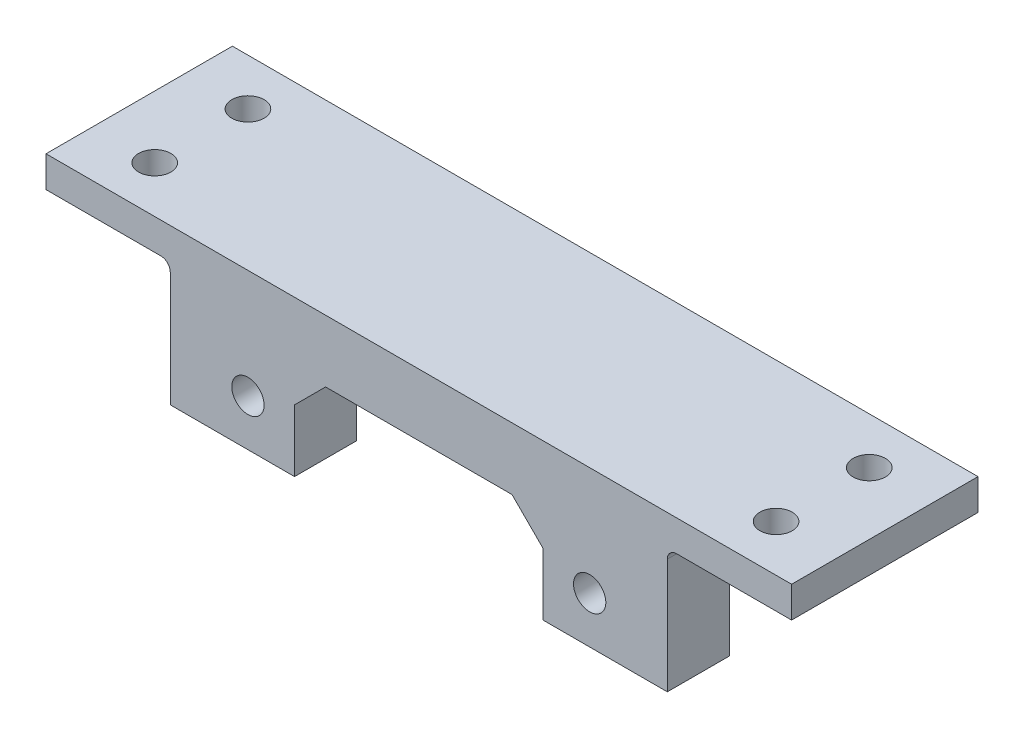
ISO-10303-21;
HEADER;
FILE_DESCRIPTION(('STEP AP214'),'2;1');
FILE_NAME('part.step','',(''),(''),'','','');
FILE_SCHEMA(('AUTOMOTIVE_DESIGN { 1 0 10303 214 1 1 1 1 }'));
ENDSEC;
DATA;
#1=APPLICATION_CONTEXT('core data for automotive mechanical design processes');
#2=APPLICATION_PROTOCOL_DEFINITION('international standard','automotive_design',2000,#1);
#3=PRODUCT_CONTEXT('',#1,'mechanical');
#4=PRODUCT('Part','Part','',(#3));
#5=PRODUCT_RELATED_PRODUCT_CATEGORY('part','',(#4));
#6=PRODUCT_DEFINITION_FORMATION('','',#4);
#7=PRODUCT_DEFINITION_CONTEXT('part definition',#1,'design');
#8=PRODUCT_DEFINITION('design','',#6,#7);
#9=PRODUCT_DEFINITION_SHAPE('','',#8);
#10=(LENGTH_UNIT() NAMED_UNIT(*) SI_UNIT(.MILLI.,.METRE.));
#11=(NAMED_UNIT(*) PLANE_ANGLE_UNIT() SI_UNIT($,.RADIAN.));
#12=(NAMED_UNIT(*) SI_UNIT($,.STERADIAN.) SOLID_ANGLE_UNIT());
#13=UNCERTAINTY_MEASURE_WITH_UNIT(LENGTH_MEASURE(1.E-05),#10,'distance_accuracy_value','');
#14=(GEOMETRIC_REPRESENTATION_CONTEXT(3) GLOBAL_UNCERTAINTY_ASSIGNED_CONTEXT((#13)) GLOBAL_UNIT_ASSIGNED_CONTEXT((#10,
#11,#12)) REPRESENTATION_CONTEXT('',''));
#15=CARTESIAN_POINT('',(0.,0.,0.));
#16=DIRECTION('',(0.,0.,1.));
#17=DIRECTION('',(1.,0.,0.));
#18=AXIS2_PLACEMENT_3D('',#15,#16,#17);
#19=CARTESIAN_POINT('',(0.,-20.,30.));
#20=DIRECTION('',(0.,1.,0.));
#21=DIRECTION('',(0.,0.,1.));
#22=AXIS2_PLACEMENT_3D('',#19,#20,#21);
#23=PLANE('',#22);
#24=DIRECTION('',(0.,0.,-1.));
#25=VECTOR('',#24,1.);
#26=CARTESIAN_POINT('',(40.,-20.,30.));
#27=LINE('',#26,#25);
#28=CARTESIAN_POINT('',(40.,-20.,10.));
#29=VERTEX_POINT('',#28);
#30=CARTESIAN_POINT('',(40.,-20.,0.));
#31=VERTEX_POINT('',#30);
#32=EDGE_CURVE('E367',#29,#31,#27,.T.);
#33=ORIENTED_EDGE('',*,*,#32,.F.);
#34=DIRECTION('',(-1.,0.,0.));
#35=VECTOR('',#34,1.);
#36=CARTESIAN_POINT('',(120.,-19.9999999999999,10.));
#37=LINE('',#36,#35);
#38=CARTESIAN_POINT('',(20.,-20.,10.));
#39=VERTEX_POINT('',#38);
#40=EDGE_CURVE('E557',#29,#39,#37,.T.);
#41=ORIENTED_EDGE('',*,*,#40,.T.);
#42=DIRECTION('',(0.,0.,-1.));
#43=VECTOR('',#42,1.);
#44=CARTESIAN_POINT('',(20.,-20.,30.));
#45=LINE('',#44,#43);
#46=CARTESIAN_POINT('',(20.,-20.,0.));
#47=VERTEX_POINT('',#46);
#48=EDGE_CURVE('E238',#39,#47,#45,.T.);
#49=ORIENTED_EDGE('',*,*,#48,.T.);
#50=DIRECTION('',(1.,0.,0.));
#51=VECTOR('',#50,1.);
#52=CARTESIAN_POINT('',(0.,-20.,0.));
#53=LINE('',#52,#51);
#54=EDGE_CURVE('E340',#47,#31,#53,.T.);
#55=ORIENTED_EDGE('',*,*,#54,.T.);
#56=EDGE_LOOP('',(#33,#41,#49,#55));
#57=FACE_BOUND('',#56,.T.);
#58=ADVANCED_FACE('F37',(#57),#23,.F.);
#59=CARTESIAN_POINT('',(40.,0.,30.));
#60=DIRECTION('',(-1.,0.,0.));
#61=DIRECTION('',(0.,0.,1.));
#62=AXIS2_PLACEMENT_3D('',#59,#60,#61);
#63=PLANE('',#62);
#64=DIRECTION('',(0.,0.,1.));
#65=VECTOR('',#64,1.);
#66=CARTESIAN_POINT('',(40.,-9.99999999999996,30.));
#67=LINE('',#66,#65);
#68=CARTESIAN_POINT('',(40.,-9.99999999999996,0.));
#69=VERTEX_POINT('',#68);
#70=CARTESIAN_POINT('',(40.,-9.99999999999996,9.99999999999999));
#71=VERTEX_POINT('',#70);
#72=EDGE_CURVE('E266',#69,#71,#67,.T.);
#73=ORIENTED_EDGE('',*,*,#72,.T.);
#74=DIRECTION('',(0.,-1.,0.));
#75=VECTOR('',#74,1.);
#76=CARTESIAN_POINT('',(40.,0.,9.99999999999999));
#77=LINE('',#76,#75);
#78=EDGE_CURVE('E566',#71,#29,#77,.T.);
#79=ORIENTED_EDGE('',*,*,#78,.T.);
#80=ORIENTED_EDGE('',*,*,#32,.T.);
#81=DIRECTION('',(0.,1.,0.));
#82=VECTOR('',#81,1.);
#83=CARTESIAN_POINT('',(40.,0.,0.));
#84=LINE('',#83,#82);
#85=EDGE_CURVE('E348',#31,#69,#84,.T.);
#86=ORIENTED_EDGE('',*,*,#85,.T.);
#87=EDGE_LOOP('',(#73,#79,#80,#86));
#88=FACE_BOUND('',#87,.T.);
#89=ADVANCED_FACE('F482',(#88),#63,.F.);
#90=CARTESIAN_POINT('',(80.,0.,30.));
#91=DIRECTION('',(1.,0.,0.));
#92=DIRECTION('',(0.,0.,-1.));
#93=AXIS2_PLACEMENT_3D('',#90,#91,#92);
#94=PLANE('',#93);
#95=DIRECTION('',(0.,0.,-1.));
#96=VECTOR('',#95,1.);
#97=CARTESIAN_POINT('',(80.,-20.,30.));
#98=LINE('',#97,#96);
#99=CARTESIAN_POINT('',(80.,-19.9999999999999,10.));
#100=VERTEX_POINT('',#99);
#101=CARTESIAN_POINT('',(80.,-20.,0.));
#102=VERTEX_POINT('',#101);
#103=EDGE_CURVE('E363',#100,#102,#98,.T.);
#104=ORIENTED_EDGE('',*,*,#103,.F.);
#105=DIRECTION('',(0.,1.,0.));
#106=VECTOR('',#105,1.);
#107=CARTESIAN_POINT('',(80.,0.,9.99999999999999));
#108=LINE('',#107,#106);
#109=CARTESIAN_POINT('',(80.,-10.,9.99999999999999));
#110=VERTEX_POINT('',#109);
#111=EDGE_CURVE('E444',#100,#110,#108,.T.);
#112=ORIENTED_EDGE('',*,*,#111,.T.);
#113=DIRECTION('',(0.,0.,-1.));
#114=VECTOR('',#113,1.);
#115=CARTESIAN_POINT('',(80.,-10.,0.));
#116=LINE('',#115,#114);
#117=CARTESIAN_POINT('',(80.,-10.,0.));
#118=VERTEX_POINT('',#117);
#119=EDGE_CURVE('E253',#110,#118,#116,.T.);
#120=ORIENTED_EDGE('',*,*,#119,.T.);
#121=DIRECTION('',(0.,-1.,0.));
#122=VECTOR('',#121,1.);
#123=CARTESIAN_POINT('',(80.,0.,0.));
#124=LINE('',#123,#122);
#125=EDGE_CURVE('E354',#118,#102,#124,.T.);
#126=ORIENTED_EDGE('',*,*,#125,.T.);
#127=EDGE_LOOP('',(#104,#112,#120,#126));
#128=FACE_BOUND('',#127,.T.);
#129=ADVANCED_FACE('F382',(#128),#94,.F.);
#130=CARTESIAN_POINT('',(0.,-20.,30.));
#131=DIRECTION('',(0.,1.,0.));
#132=DIRECTION('',(0.,0.,1.));
#133=AXIS2_PLACEMENT_3D('',#130,#131,#132);
#134=PLANE('',#133);
#135=DIRECTION('',(0.,0.,-1.));
#136=VECTOR('',#135,1.);
#137=CARTESIAN_POINT('',(100.,-20.,30.));
#138=LINE('',#137,#136);
#139=CARTESIAN_POINT('',(100.,-19.9999999999999,10.));
#140=VERTEX_POINT('',#139);
#141=CARTESIAN_POINT('',(100.,-20.,0.));
#142=VERTEX_POINT('',#141);
#143=EDGE_CURVE('E364',#140,#142,#138,.T.);
#144=ORIENTED_EDGE('',*,*,#143,.F.);
#145=EDGE_CURVE('E378',#140,#100,#37,.T.);
#146=ORIENTED_EDGE('',*,*,#145,.T.);
#147=ORIENTED_EDGE('',*,*,#103,.T.);
#148=DIRECTION('',(1.,0.,0.));
#149=VECTOR('',#148,1.);
#150=CARTESIAN_POINT('',(0.,-20.,0.));
#151=LINE('',#150,#149);
#152=EDGE_CURVE('E357',#102,#142,#151,.T.);
#153=ORIENTED_EDGE('',*,*,#152,.T.);
#154=EDGE_LOOP('',(#144,#146,#147,#153));
#155=FACE_BOUND('',#154,.T.);
#156=ADVANCED_FACE('F376',(#155),#134,.F.);
#157=CARTESIAN_POINT('',(80.,-10.,30.));
#158=DIRECTION('',(-0.707106781186552,-0.707106781186544,0.));
#159=DIRECTION('',(0.,0.,1.));
#160=AXIS2_PLACEMENT_3D('',#157,#158,#159);
#161=PLANE('',#160);
#162=ORIENTED_EDGE('',*,*,#119,.F.);
#163=DIRECTION('',(0.707106781186544,-0.707106781186552,0.));
#164=VECTOR('',#163,1.);
#165=CARTESIAN_POINT('',(80.,-10.,9.99999999999999));
#166=LINE('',#165,#164);
#167=CARTESIAN_POINT('',(75.,-4.99999999999995,10.));
#168=VERTEX_POINT('',#167);
#169=EDGE_CURVE('E449',#110,#168,#166,.F.);
#170=ORIENTED_EDGE('',*,*,#169,.T.);
#171=DIRECTION('',(0.,0.,1.));
#172=VECTOR('',#171,1.);
#173=CARTESIAN_POINT('',(75.,-5.,30.));
#174=LINE('',#173,#172);
#175=CARTESIAN_POINT('',(75.,-5.,0.));
#176=VERTEX_POINT('',#175);
#177=EDGE_CURVE('E262',#176,#168,#174,.T.);
#178=ORIENTED_EDGE('',*,*,#177,.F.);
#179=DIRECTION('',(0.707106781186544,-0.707106781186552,0.));
#180=VECTOR('',#179,1.);
#181=CARTESIAN_POINT('',(35.0000000000004,35.,0.));
#182=LINE('',#181,#180);
#183=EDGE_CURVE('E269',#118,#176,#182,.F.);
#184=ORIENTED_EDGE('',*,*,#183,.F.);
#185=EDGE_LOOP('',(#162,#170,#178,#184));
#186=FACE_BOUND('',#185,.T.);
#187=ADVANCED_FACE('F571',(#186),#161,.T.);
#188=CARTESIAN_POINT('',(45.0000000000001,-5.,30.));
#189=DIRECTION('',(0.707106781186543,-0.707106781186552,0.));
#190=DIRECTION('',(0.,0.,1.));
#191=AXIS2_PLACEMENT_3D('',#188,#189,#190);
#192=PLANE('',#191);
#193=DIRECTION('',(0.,0.,-1.));
#194=VECTOR('',#193,1.);
#195=CARTESIAN_POINT('',(45.0000000000001,-5.,0.));
#196=LINE('',#195,#194);
#197=CARTESIAN_POINT('',(45.0000000000001,-4.99999999999998,10.));
#198=VERTEX_POINT('',#197);
#199=CARTESIAN_POINT('',(45.0000000000001,-5.,0.));
#200=VERTEX_POINT('',#199);
#201=EDGE_CURVE('E257',#198,#200,#196,.T.);
#202=ORIENTED_EDGE('',*,*,#201,.F.);
#203=DIRECTION('',(0.707106781186552,0.707106781186543,0.));
#204=VECTOR('',#203,1.);
#205=CARTESIAN_POINT('',(45.0000000000001,-5.,9.99999999999999));
#206=LINE('',#205,#204);
#207=EDGE_CURVE('E290',#198,#71,#206,.F.);
#208=ORIENTED_EDGE('',*,*,#207,.T.);
#209=ORIENTED_EDGE('',*,*,#72,.F.);
#210=DIRECTION('',(0.707106781186552,0.707106781186543,0.));
#211=VECTOR('',#210,1.);
#212=CARTESIAN_POINT('',(24.9999999999997,-25.0000000000001,0.));
#213=LINE('',#212,#211);
#214=EDGE_CURVE('E273',#200,#69,#213,.F.);
#215=ORIENTED_EDGE('',*,*,#214,.F.);
#216=EDGE_LOOP('',(#202,#208,#209,#215));
#217=FACE_BOUND('',#216,.T.);
#218=ADVANCED_FACE('F526',(#217),#192,.T.);
#219=CARTESIAN_POINT('',(100.,0.,30.));
#220=DIRECTION('',(-1.,0.,0.));
#221=DIRECTION('',(0.,0.,1.));
#222=AXIS2_PLACEMENT_3D('',#219,#220,#221);
#223=PLANE('',#222);
#224=DIRECTION('',(0.,1.,0.));
#225=VECTOR('',#224,1.);
#226=CARTESIAN_POINT('',(100.,0.,0.));
#227=LINE('',#226,#225);
#228=CARTESIAN_POINT('',(100.,-1.5,0.));
#229=VERTEX_POINT('',#228);
#230=EDGE_CURVE('E281',#142,#229,#227,.T.);
#231=ORIENTED_EDGE('',*,*,#230,.T.);
#232=DIRECTION('',(0.,0.,-1.));
#233=VECTOR('',#232,1.);
#234=CARTESIAN_POINT('',(100.,-1.5,30.));
#235=LINE('',#234,#233);
#236=CARTESIAN_POINT('',(100.,-1.5,30.));
#237=VERTEX_POINT('',#236);
#238=EDGE_CURVE('E52',#229,#237,#235,.F.);
#239=ORIENTED_EDGE('',*,*,#238,.T.);
#240=DIRECTION('',(0.,1.,0.));
#241=VECTOR('',#240,1.);
#242=CARTESIAN_POINT('',(100.,0.,30.));
#243=LINE('',#242,#241);
#244=CARTESIAN_POINT('',(100.,-20.,30.));
#245=VERTEX_POINT('',#244);
#246=EDGE_CURVE('E360',#245,#237,#243,.T.);
#247=ORIENTED_EDGE('',*,*,#246,.F.);
#248=CARTESIAN_POINT('',(100.,-19.9999999999999,20.));
#249=VERTEX_POINT('',#248);
#250=EDGE_CURVE('E361',#245,#249,#138,.T.);
#251=ORIENTED_EDGE('',*,*,#250,.T.);
#252=DIRECTION('',(0.,1.,0.));
#253=VECTOR('',#252,1.);
#254=CARTESIAN_POINT('',(100.,0.,20.));
#255=LINE('',#254,#253);
#256=CARTESIAN_POINT('',(100.,-4.99999999999993,20.));
#257=VERTEX_POINT('',#256);
#258=EDGE_CURVE('E563',#249,#257,#255,.T.);
#259=ORIENTED_EDGE('',*,*,#258,.T.);
#260=DIRECTION('',(0.,0.,-1.));
#261=VECTOR('',#260,1.);
#262=CARTESIAN_POINT('',(100.,-4.99999999999993,30.));
#263=LINE('',#262,#261);
#264=CARTESIAN_POINT('',(100.,-4.99999999999993,10.));
#265=VERTEX_POINT('',#264);
#266=EDGE_CURVE('E440',#257,#265,#263,.T.);
#267=ORIENTED_EDGE('',*,*,#266,.T.);
#268=DIRECTION('',(0.,-1.,0.));
#269=VECTOR('',#268,1.);
#270=CARTESIAN_POINT('',(100.,0.,9.99999999999999));
#271=LINE('',#270,#269);
#272=EDGE_CURVE('E438',#265,#140,#271,.T.);
#273=ORIENTED_EDGE('',*,*,#272,.T.);
#274=ORIENTED_EDGE('',*,*,#143,.T.);
#275=EDGE_LOOP('',(#231,#239,#247,#251,#259,#267,#273,#274));
#276=FACE_BOUND('',#275,.T.);
#277=ADVANCED_FACE('F436',(#276),#223,.F.);
#278=CARTESIAN_POINT('',(0.,0.,30.));
#279=DIRECTION('',(0.,1.,0.));
#280=DIRECTION('',(0.,0.,1.));
#281=AXIS2_PLACEMENT_3D('',#278,#279,#280);
#282=PLANE('',#281);
#283=CARTESIAN_POINT('',(110.,0.,7.5));
#284=DIRECTION('',(0.,1.,0.));
#285=DIRECTION('',(0.,0.,1.));
#286=AXIS2_PLACEMENT_3D('',#283,#284,#285);
#287=CIRCLE('',#286,2.6);
#288=CARTESIAN_POINT('',(110.,0.,10.1));
#289=VERTEX_POINT('',#288);
#290=EDGE_CURVE('E458',#289,#289,#287,.T.);
#291=ORIENTED_EDGE('',*,*,#290,.T.);
#292=EDGE_LOOP('',(#291));
#293=FACE_BOUND('',#292,.T.);
#294=CARTESIAN_POINT('',(110.,0.,22.5));
#295=DIRECTION('',(0.,1.,0.));
#296=DIRECTION('',(0.,0.,1.));
#297=AXIS2_PLACEMENT_3D('',#294,#295,#296);
#298=CIRCLE('',#297,2.6);
#299=CARTESIAN_POINT('',(110.,0.,25.1));
#300=VERTEX_POINT('',#299);
#301=EDGE_CURVE('E286',#300,#300,#298,.T.);
#302=ORIENTED_EDGE('',*,*,#301,.T.);
#303=EDGE_LOOP('',(#302));
#304=FACE_BOUND('',#303,.T.);
#305=DIRECTION('',(1.,0.,0.));
#306=VECTOR('',#305,1.);
#307=CARTESIAN_POINT('',(0.,0.,30.));
#308=LINE('',#307,#306);
#309=CARTESIAN_POINT('',(101.5,0.,30.));
#310=VERTEX_POINT('',#309);
#311=CARTESIAN_POINT('',(120.,0.,30.));
#312=VERTEX_POINT('',#311);
#313=EDGE_CURVE('E411',#310,#312,#308,.T.);
#314=ORIENTED_EDGE('',*,*,#313,.F.);
#315=DIRECTION('',(0.,0.,-1.));
#316=VECTOR('',#315,1.);
#317=CARTESIAN_POINT('',(101.5,0.,0.));
#318=LINE('',#317,#316);
#319=CARTESIAN_POINT('',(101.5,0.,0.));
#320=VERTEX_POINT('',#319);
#321=EDGE_CURVE('E307',#310,#320,#318,.T.);
#322=ORIENTED_EDGE('',*,*,#321,.T.);
#323=DIRECTION('',(1.,0.,0.));
#324=VECTOR('',#323,1.);
#325=CARTESIAN_POINT('',(0.,0.,0.));
#326=LINE('',#325,#324);
#327=CARTESIAN_POINT('',(120.,0.,0.));
#328=VERTEX_POINT('',#327);
#329=EDGE_CURVE('E385',#320,#328,#326,.T.);
#330=ORIENTED_EDGE('',*,*,#329,.T.);
#331=DIRECTION('',(0.,0.,-1.));
#332=VECTOR('',#331,1.);
#333=CARTESIAN_POINT('',(120.,0.,30.));
#334=LINE('',#333,#332);
#335=EDGE_CURVE('E250',#312,#328,#334,.T.);
#336=ORIENTED_EDGE('',*,*,#335,.F.);
#337=EDGE_LOOP('',(#314,#322,#330,#336));
#338=FACE_BOUND('',#337,.T.);
#339=ADVANCED_FACE('F410',(#293,#304,#338),#282,.F.);
#340=CARTESIAN_POINT('',(120.,0.,30.));
#341=DIRECTION('',(-1.,0.,0.));
#342=DIRECTION('',(0.,0.,1.));
#343=AXIS2_PLACEMENT_3D('',#340,#341,#342);
#344=PLANE('',#343);
#345=DIRECTION('',(0.,1.,0.));
#346=VECTOR('',#345,1.);
#347=CARTESIAN_POINT('',(120.,0.,0.));
#348=LINE('',#347,#346);
#349=CARTESIAN_POINT('',(120.,5.,0.));
#350=VERTEX_POINT('',#349);
#351=EDGE_CURVE('E387',#328,#350,#348,.T.);
#352=ORIENTED_EDGE('',*,*,#351,.T.);
#353=DIRECTION('',(0.,0.,-1.));
#354=VECTOR('',#353,1.);
#355=CARTESIAN_POINT('',(120.,5.,30.));
#356=LINE('',#355,#354);
#357=CARTESIAN_POINT('',(120.,5.,30.));
#358=VERTEX_POINT('',#357);
#359=EDGE_CURVE('E248',#358,#350,#356,.T.);
#360=ORIENTED_EDGE('',*,*,#359,.F.);
#361=DIRECTION('',(0.,1.,0.));
#362=VECTOR('',#361,1.);
#363=CARTESIAN_POINT('',(120.,0.,30.));
#364=LINE('',#363,#362);
#365=EDGE_CURVE('E407',#312,#358,#364,.T.);
#366=ORIENTED_EDGE('',*,*,#365,.F.);
#367=ORIENTED_EDGE('',*,*,#335,.T.);
#368=EDGE_LOOP('',(#352,#360,#366,#367));
#369=FACE_BOUND('',#368,.T.);
#370=ADVANCED_FACE('F405',(#369),#344,.F.);
#371=CARTESIAN_POINT('',(0.,5.,30.));
#372=DIRECTION('',(0.,1.,0.));
#373=DIRECTION('',(0.,0.,1.));
#374=AXIS2_PLACEMENT_3D('',#371,#372,#373);
#375=PLANE('',#374);
#376=CARTESIAN_POINT('',(10.,5.,22.5));
#377=DIRECTION('',(0.,1.,0.));
#378=DIRECTION('',(0.,0.,1.));
#379=AXIS2_PLACEMENT_3D('',#376,#377,#378);
#380=CIRCLE('',#379,2.6);
#381=CARTESIAN_POINT('',(10.,5.,25.1));
#382=VERTEX_POINT('',#381);
#383=EDGE_CURVE('E287',#382,#382,#380,.T.);
#384=ORIENTED_EDGE('',*,*,#383,.F.);
#385=EDGE_LOOP('',(#384));
#386=FACE_BOUND('',#385,.T.);
#387=CARTESIAN_POINT('',(110.,5.,7.5));
#388=DIRECTION('',(0.,1.,0.));
#389=DIRECTION('',(0.,0.,1.));
#390=AXIS2_PLACEMENT_3D('',#387,#388,#389);
#391=CIRCLE('',#390,2.6);
#392=CARTESIAN_POINT('',(110.,5.,10.1));
#393=VERTEX_POINT('',#392);
#394=EDGE_CURVE('E447',#393,#393,#391,.T.);
#395=ORIENTED_EDGE('',*,*,#394,.F.);
#396=EDGE_LOOP('',(#395));
#397=FACE_BOUND('',#396,.T.);
#398=CARTESIAN_POINT('',(110.,5.,22.5));
#399=DIRECTION('',(0.,1.,0.));
#400=DIRECTION('',(0.,0.,1.));
#401=AXIS2_PLACEMENT_3D('',#398,#399,#400);
#402=CIRCLE('',#401,2.6);
#403=CARTESIAN_POINT('',(110.,5.,25.1));
#404=VERTEX_POINT('',#403);
#405=EDGE_CURVE('E443',#404,#404,#402,.T.);
#406=ORIENTED_EDGE('',*,*,#405,.F.);
#407=EDGE_LOOP('',(#406));
#408=FACE_BOUND('',#407,.T.);
#409=CARTESIAN_POINT('',(10.,5.,7.5));
#410=DIRECTION('',(0.,1.,0.));
#411=DIRECTION('',(0.,0.,1.));
#412=AXIS2_PLACEMENT_3D('',#409,#410,#411);
#413=CIRCLE('',#412,2.6);
#414=CARTESIAN_POINT('',(10.,5.,10.1));
#415=VERTEX_POINT('',#414);
#416=EDGE_CURVE('E282',#415,#415,#413,.T.);
#417=ORIENTED_EDGE('',*,*,#416,.F.);
#418=EDGE_LOOP('',(#417));
#419=FACE_BOUND('',#418,.T.);
#420=DIRECTION('',(1.,0.,0.));
#421=VECTOR('',#420,1.);
#422=CARTESIAN_POINT('',(0.,5.,0.));
#423=LINE('',#422,#421);
#424=CARTESIAN_POINT('',(0.,5.,0.));
#425=VERTEX_POINT('',#424);
#426=EDGE_CURVE('E342',#425,#350,#423,.T.);
#427=ORIENTED_EDGE('',*,*,#426,.F.);
#428=DIRECTION('',(0.,0.,-1.));
#429=VECTOR('',#428,1.);
#430=CARTESIAN_POINT('',(0.,5.,30.));
#431=LINE('',#430,#429);
#432=CARTESIAN_POINT('',(0.,5.,30.));
#433=VERTEX_POINT('',#432);
#434=EDGE_CURVE('E240',#433,#425,#431,.T.);
#435=ORIENTED_EDGE('',*,*,#434,.F.);
#436=DIRECTION('',(1.,0.,0.));
#437=VECTOR('',#436,1.);
#438=CARTESIAN_POINT('',(0.,5.,30.));
#439=LINE('',#438,#437);
#440=EDGE_CURVE('E402',#433,#358,#439,.T.);
#441=ORIENTED_EDGE('',*,*,#440,.T.);
#442=ORIENTED_EDGE('',*,*,#359,.T.);
#443=EDGE_LOOP('',(#427,#435,#441,#442));
#444=FACE_BOUND('',#443,.T.);
#445=ADVANCED_FACE('F398',(#386,#397,#408,#419,#444),#375,.T.);
#446=CARTESIAN_POINT('',(0.,0.,30.));
#447=DIRECTION('',(-1.,0.,0.));
#448=DIRECTION('',(0.,0.,1.));
#449=AXIS2_PLACEMENT_3D('',#446,#447,#448);
#450=PLANE('',#449);
#451=DIRECTION('',(0.,1.,0.));
#452=VECTOR('',#451,1.);
#453=CARTESIAN_POINT('',(0.,0.,0.));
#454=LINE('',#453,#452);
#455=CARTESIAN_POINT('',(0.,0.,0.));
#456=VERTEX_POINT('',#455);
#457=EDGE_CURVE('E338',#456,#425,#454,.T.);
#458=ORIENTED_EDGE('',*,*,#457,.F.);
#459=DIRECTION('',(0.,0.,-1.));
#460=VECTOR('',#459,1.);
#461=CARTESIAN_POINT('',(0.,0.,30.));
#462=LINE('',#461,#460);
#463=CARTESIAN_POINT('',(0.,0.,30.));
#464=VERTEX_POINT('',#463);
#465=EDGE_CURVE('E237',#464,#456,#462,.T.);
#466=ORIENTED_EDGE('',*,*,#465,.F.);
#467=DIRECTION('',(0.,1.,0.));
#468=VECTOR('',#467,1.);
#469=CARTESIAN_POINT('',(0.,0.,30.));
#470=LINE('',#469,#468);
#471=EDGE_CURVE('E423',#464,#433,#470,.T.);
#472=ORIENTED_EDGE('',*,*,#471,.T.);
#473=ORIENTED_EDGE('',*,*,#434,.T.);
#474=EDGE_LOOP('',(#458,#466,#472,#473));
#475=FACE_BOUND('',#474,.T.);
#476=ADVANCED_FACE('F469',(#475),#450,.T.);
#477=CARTESIAN_POINT('',(0.,0.,30.));
#478=DIRECTION('',(0.,1.,0.));
#479=DIRECTION('',(0.,0.,1.));
#480=AXIS2_PLACEMENT_3D('',#477,#478,#479);
#481=PLANE('',#480);
#482=CARTESIAN_POINT('',(10.,0.,22.5));
#483=DIRECTION('',(0.,1.,0.));
#484=DIRECTION('',(0.,0.,1.));
#485=AXIS2_PLACEMENT_3D('',#482,#483,#484);
#486=CIRCLE('',#485,2.6);
#487=CARTESIAN_POINT('',(10.,0.,25.1));
#488=VERTEX_POINT('',#487);
#489=EDGE_CURVE('E283',#488,#488,#486,.T.);
#490=ORIENTED_EDGE('',*,*,#489,.T.);
#491=EDGE_LOOP('',(#490));
#492=FACE_BOUND('',#491,.T.);
#493=CARTESIAN_POINT('',(10.,0.,7.5));
#494=DIRECTION('',(0.,1.,0.));
#495=DIRECTION('',(0.,0.,1.));
#496=AXIS2_PLACEMENT_3D('',#493,#494,#495);
#497=CIRCLE('',#496,2.6);
#498=CARTESIAN_POINT('',(10.,0.,10.1));
#499=VERTEX_POINT('',#498);
#500=EDGE_CURVE('E278',#499,#499,#497,.T.);
#501=ORIENTED_EDGE('',*,*,#500,.T.);
#502=EDGE_LOOP('',(#501));
#503=FACE_BOUND('',#502,.T.);
#504=DIRECTION('',(1.,0.,0.));
#505=VECTOR('',#504,1.);
#506=CARTESIAN_POINT('',(0.,0.,0.));
#507=LINE('',#506,#505);
#508=CARTESIAN_POINT('',(18.5,0.,0.));
#509=VERTEX_POINT('',#508);
#510=EDGE_CURVE('E332',#456,#509,#507,.T.);
#511=ORIENTED_EDGE('',*,*,#510,.T.);
#512=DIRECTION('',(0.,0.,-1.));
#513=VECTOR('',#512,1.);
#514=CARTESIAN_POINT('',(18.5,0.,30.));
#515=LINE('',#514,#513);
#516=CARTESIAN_POINT('',(18.5,0.,30.));
#517=VERTEX_POINT('',#516);
#518=EDGE_CURVE('E305',#509,#517,#515,.F.);
#519=ORIENTED_EDGE('',*,*,#518,.T.);
#520=DIRECTION('',(1.,0.,0.));
#521=VECTOR('',#520,1.);
#522=CARTESIAN_POINT('',(0.,0.,30.));
#523=LINE('',#522,#521);
#524=EDGE_CURVE('E321',#464,#517,#523,.T.);
#525=ORIENTED_EDGE('',*,*,#524,.F.);
#526=ORIENTED_EDGE('',*,*,#465,.T.);
#527=EDGE_LOOP('',(#511,#519,#525,#526));
#528=FACE_BOUND('',#527,.T.);
#529=ADVANCED_FACE('F337',(#492,#503,#528),#481,.F.);
#530=CARTESIAN_POINT('',(20.,0.,30.));
#531=DIRECTION('',(1.,0.,0.));
#532=DIRECTION('',(0.,1.,0.));
#533=AXIS2_PLACEMENT_3D('',#530,#531,#532);
#534=PLANE('',#533);
#535=DIRECTION('',(0.,-1.,0.));
#536=VECTOR('',#535,1.);
#537=CARTESIAN_POINT('',(20.,0.,30.));
#538=LINE('',#537,#536);
#539=CARTESIAN_POINT('',(20.,-1.5,30.));
#540=VERTEX_POINT('',#539);
#541=CARTESIAN_POINT('',(20.,-20.,30.));
#542=VERTEX_POINT('',#541);
#543=EDGE_CURVE('E318',#540,#542,#538,.T.);
#544=ORIENTED_EDGE('',*,*,#543,.F.);
#545=DIRECTION('',(0.,0.,-1.));
#546=VECTOR('',#545,1.);
#547=CARTESIAN_POINT('',(20.,-1.5,0.));
#548=LINE('',#547,#546);
#549=CARTESIAN_POINT('',(20.,-1.5,0.));
#550=VERTEX_POINT('',#549);
#551=EDGE_CURVE('E293',#540,#550,#548,.T.);
#552=ORIENTED_EDGE('',*,*,#551,.T.);
#553=DIRECTION('',(0.,-1.,0.));
#554=VECTOR('',#553,1.);
#555=CARTESIAN_POINT('',(20.,0.,0.));
#556=LINE('',#555,#554);
#557=EDGE_CURVE('E335',#550,#47,#556,.T.);
#558=ORIENTED_EDGE('',*,*,#557,.T.);
#559=ORIENTED_EDGE('',*,*,#48,.F.);
#560=DIRECTION('',(0.,-1.,0.));
#561=VECTOR('',#560,1.);
#562=CARTESIAN_POINT('',(20.,-20.,10.));
#563=LINE('',#562,#561);
#564=CARTESIAN_POINT('',(20.,-5.,10.));
#565=VERTEX_POINT('',#564);
#566=EDGE_CURVE('E222',#565,#39,#563,.T.);
#567=ORIENTED_EDGE('',*,*,#566,.F.);
#568=DIRECTION('',(0.,0.,-1.));
#569=VECTOR('',#568,1.);
#570=CARTESIAN_POINT('',(20.,-5.,10.));
#571=LINE('',#570,#569);
#572=CARTESIAN_POINT('',(20.,-5.,20.));
#573=VERTEX_POINT('',#572);
#574=EDGE_CURVE('E232',#573,#565,#571,.T.);
#575=ORIENTED_EDGE('',*,*,#574,.F.);
#576=DIRECTION('',(0.,1.,0.));
#577=VECTOR('',#576,1.);
#578=CARTESIAN_POINT('',(20.,-5.,20.));
#579=LINE('',#578,#577);
#580=CARTESIAN_POINT('',(20.,-20.,20.));
#581=VERTEX_POINT('',#580);
#582=EDGE_CURVE('E213',#581,#573,#579,.T.);
#583=ORIENTED_EDGE('',*,*,#582,.F.);
#584=EDGE_CURVE('E228',#542,#581,#45,.T.);
#585=ORIENTED_EDGE('',*,*,#584,.F.);
#586=EDGE_LOOP('',(#544,#552,#558,#559,#567,#575,#583,#585));
#587=FACE_BOUND('',#586,.T.);
#588=ADVANCED_FACE('F227',(#587),#534,.F.);
#589=ORIENTED_EDGE('',*,*,#584,.T.);
#590=DIRECTION('',(-1.,0.,0.));
#591=VECTOR('',#590,1.);
#592=CARTESIAN_POINT('',(120.,-19.9999999999999,20.));
#593=LINE('',#592,#591);
#594=CARTESIAN_POINT('',(40.,-20.,20.));
#595=VERTEX_POINT('',#594);
#596=EDGE_CURVE('E210',#595,#581,#593,.T.);
#597=ORIENTED_EDGE('',*,*,#596,.F.);
#598=CARTESIAN_POINT('',(40.,-20.,30.));
#599=VERTEX_POINT('',#598);
#600=EDGE_CURVE('E243',#599,#595,#27,.T.);
#601=ORIENTED_EDGE('',*,*,#600,.F.);
#602=DIRECTION('',(1.,0.,0.));
#603=VECTOR('',#602,1.);
#604=CARTESIAN_POINT('',(0.,-20.,30.));
#605=LINE('',#604,#603);
#606=EDGE_CURVE('E236',#542,#599,#605,.T.);
#607=ORIENTED_EDGE('',*,*,#606,.F.);
#608=EDGE_LOOP('',(#589,#597,#601,#607));
#609=FACE_BOUND('',#608,.T.);
#610=ADVANCED_FACE('F235',(#609),#23,.F.);
#611=ORIENTED_EDGE('',*,*,#600,.T.);
#612=DIRECTION('',(0.,1.,0.));
#613=VECTOR('',#612,1.);
#614=CARTESIAN_POINT('',(40.,0.,20.));
#615=LINE('',#614,#613);
#616=CARTESIAN_POINT('',(40.,-9.99999999999996,20.));
#617=VERTEX_POINT('',#616);
#618=EDGE_CURVE('E216',#595,#617,#615,.T.);
#619=ORIENTED_EDGE('',*,*,#618,.T.);
#620=CARTESIAN_POINT('',(40.,-9.99999999999996,30.));
#621=VERTEX_POINT('',#620);
#622=EDGE_CURVE('E265',#617,#621,#67,.T.);
#623=ORIENTED_EDGE('',*,*,#622,.T.);
#624=DIRECTION('',(0.,1.,0.));
#625=VECTOR('',#624,1.);
#626=CARTESIAN_POINT('',(40.,0.,30.));
#627=LINE('',#626,#625);
#628=EDGE_CURVE('E428',#599,#621,#627,.T.);
#629=ORIENTED_EDGE('',*,*,#628,.F.);
#630=EDGE_LOOP('',(#611,#619,#623,#629));
#631=FACE_BOUND('',#630,.T.);
#632=ADVANCED_FACE('F490',(#631),#63,.F.);
#633=CARTESIAN_POINT('',(0.,-5.,30.));
#634=DIRECTION('',(0.,1.,0.));
#635=DIRECTION('',(0.,0.,1.));
#636=AXIS2_PLACEMENT_3D('',#633,#634,#635);
#637=PLANE('',#636);
#638=CARTESIAN_POINT('',(45.0000000000001,-5.,30.));
#639=VERTEX_POINT('',#638);
#640=CARTESIAN_POINT('',(45.0000000000001,-5.,20.));
#641=VERTEX_POINT('',#640);
#642=EDGE_CURVE('E258',#639,#641,#196,.T.);
#643=ORIENTED_EDGE('',*,*,#642,.T.);
#644=DIRECTION('',(-1.,0.,0.));
#645=VECTOR('',#644,1.);
#646=CARTESIAN_POINT('',(120.,-4.99999999999991,20.));
#647=LINE('',#646,#645);
#648=EDGE_CURVE('E548',#641,#573,#647,.T.);
#649=ORIENTED_EDGE('',*,*,#648,.T.);
#650=ORIENTED_EDGE('',*,*,#574,.T.);
#651=DIRECTION('',(-1.,0.,0.));
#652=VECTOR('',#651,1.);
#653=CARTESIAN_POINT('',(120.,-4.99999999999991,10.));
#654=LINE('',#653,#652);
#655=EDGE_CURVE('E582',#198,#565,#654,.T.);
#656=ORIENTED_EDGE('',*,*,#655,.F.);
#657=ORIENTED_EDGE('',*,*,#201,.T.);
#658=DIRECTION('',(1.,0.,0.));
#659=VECTOR('',#658,1.);
#660=CARTESIAN_POINT('',(0.,-5.,0.));
#661=LINE('',#660,#659);
#662=EDGE_CURVE('E351',#200,#176,#661,.T.);
#663=ORIENTED_EDGE('',*,*,#662,.T.);
#664=ORIENTED_EDGE('',*,*,#177,.T.);
#665=EDGE_CURVE('E572',#265,#168,#654,.T.);
#666=ORIENTED_EDGE('',*,*,#665,.F.);
#667=ORIENTED_EDGE('',*,*,#266,.F.);
#668=CARTESIAN_POINT('',(75.,-4.99999999999996,20.));
#669=VERTEX_POINT('',#668);
#670=EDGE_CURVE('E583',#257,#669,#647,.T.);
#671=ORIENTED_EDGE('',*,*,#670,.T.);
#672=CARTESIAN_POINT('',(75.,-5.,30.));
#673=VERTEX_POINT('',#672);
#674=EDGE_CURVE('E261',#669,#673,#174,.T.);
#675=ORIENTED_EDGE('',*,*,#674,.T.);
#676=DIRECTION('',(1.,0.,0.));
#677=VECTOR('',#676,1.);
#678=CARTESIAN_POINT('',(0.,-5.,30.));
#679=LINE('',#678,#677);
#680=EDGE_CURVE('E431',#639,#673,#679,.T.);
#681=ORIENTED_EDGE('',*,*,#680,.F.);
#682=EDGE_LOOP('',(#643,#649,#650,#656,#657,#663,#664,#666,#667,#671,#675,#681));
#683=FACE_BOUND('',#682,.T.);
#684=ADVANCED_FACE('F498',(#683),#637,.F.);
#685=CARTESIAN_POINT('',(80.,-10.,30.));
#686=VERTEX_POINT('',#685);
#687=CARTESIAN_POINT('',(80.,-10.,20.));
#688=VERTEX_POINT('',#687);
#689=EDGE_CURVE('E254',#686,#688,#116,.T.);
#690=ORIENTED_EDGE('',*,*,#689,.T.);
#691=DIRECTION('',(0.,-1.,0.));
#692=VECTOR('',#691,1.);
#693=CARTESIAN_POINT('',(80.,0.,20.));
#694=LINE('',#693,#692);
#695=CARTESIAN_POINT('',(80.,-19.9999999999999,20.));
#696=VERTEX_POINT('',#695);
#697=EDGE_CURVE('E555',#688,#696,#694,.T.);
#698=ORIENTED_EDGE('',*,*,#697,.T.);
#699=CARTESIAN_POINT('',(80.,-20.,30.));
#700=VERTEX_POINT('',#699);
#701=EDGE_CURVE('E365',#700,#696,#98,.T.);
#702=ORIENTED_EDGE('',*,*,#701,.F.);
#703=DIRECTION('',(0.,-1.,0.));
#704=VECTOR('',#703,1.);
#705=CARTESIAN_POINT('',(80.,0.,30.));
#706=LINE('',#705,#704);
#707=EDGE_CURVE('E433',#686,#700,#706,.T.);
#708=ORIENTED_EDGE('',*,*,#707,.F.);
#709=EDGE_LOOP('',(#690,#698,#702,#708));
#710=FACE_BOUND('',#709,.T.);
#711=ADVANCED_FACE('F538',(#710),#94,.F.);
#712=ORIENTED_EDGE('',*,*,#701,.T.);
#713=EDGE_CURVE('E221',#249,#696,#593,.T.);
#714=ORIENTED_EDGE('',*,*,#713,.F.);
#715=ORIENTED_EDGE('',*,*,#250,.F.);
#716=DIRECTION('',(1.,0.,0.));
#717=VECTOR('',#716,1.);
#718=CARTESIAN_POINT('',(0.,-20.,30.));
#719=LINE('',#718,#717);
#720=EDGE_CURVE('E390',#700,#245,#719,.T.);
#721=ORIENTED_EDGE('',*,*,#720,.F.);
#722=EDGE_LOOP('',(#712,#714,#715,#721));
#723=FACE_BOUND('',#722,.T.);
#724=ADVANCED_FACE('F531',(#723),#134,.F.);
#725=CARTESIAN_POINT('',(0.,0.,30.));
#726=DIRECTION('',(0.,0.,1.));
#727=DIRECTION('',(1.,0.,0.));
#728=AXIS2_PLACEMENT_3D('',#725,#726,#727);
#729=PLANE('',#728);
#730=CARTESIAN_POINT('',(32.5,-12.5,30.));
#731=DIRECTION('',(0.,0.,-1.));
#732=DIRECTION('',(-1.,0.,0.));
#733=AXIS2_PLACEMENT_3D('',#730,#731,#732);
#734=CIRCLE('',#733,2.6);
#735=CARTESIAN_POINT('',(29.9,-12.5,30.));
#736=VERTEX_POINT('',#735);
#737=EDGE_CURVE('E302',#736,#736,#734,.T.);
#738=ORIENTED_EDGE('',*,*,#737,.T.);
#739=EDGE_LOOP('',(#738));
#740=FACE_BOUND('',#739,.T.);
#741=CARTESIAN_POINT('',(87.5,-12.5,30.));
#742=DIRECTION('',(0.,0.,-1.));
#743=DIRECTION('',(-1.,0.,0.));
#744=AXIS2_PLACEMENT_3D('',#741,#742,#743);
#745=CIRCLE('',#744,2.6);
#746=CARTESIAN_POINT('',(84.9,-12.5,30.));
#747=VERTEX_POINT('',#746);
#748=EDGE_CURVE('E297',#747,#747,#745,.T.);
#749=ORIENTED_EDGE('',*,*,#748,.T.);
#750=EDGE_LOOP('',(#749));
#751=FACE_BOUND('',#750,.T.);
#752=ORIENTED_EDGE('',*,*,#246,.T.);
#753=CARTESIAN_POINT('',(101.5,-1.5,30.));
#754=DIRECTION('',(0.,0.,1.));
#755=DIRECTION('',(1.,0.,0.));
#756=AXIS2_PLACEMENT_3D('',#753,#754,#755);
#757=CIRCLE('',#756,1.5);
#758=EDGE_CURVE('E11',#237,#310,#757,.F.);
#759=ORIENTED_EDGE('',*,*,#758,.T.);
#760=ORIENTED_EDGE('',*,*,#313,.T.);
#761=ORIENTED_EDGE('',*,*,#365,.T.);
#762=ORIENTED_EDGE('',*,*,#440,.F.);
#763=ORIENTED_EDGE('',*,*,#471,.F.);
#764=ORIENTED_EDGE('',*,*,#524,.T.);
#765=CARTESIAN_POINT('',(18.5,-1.5,30.));
#766=DIRECTION('',(0.,0.,1.));
#767=DIRECTION('',(1.,0.,0.));
#768=AXIS2_PLACEMENT_3D('',#765,#766,#767);
#769=CIRCLE('',#768,1.5);
#770=EDGE_CURVE('E313',#517,#540,#769,.F.);
#771=ORIENTED_EDGE('',*,*,#770,.T.);
#772=ORIENTED_EDGE('',*,*,#543,.T.);
#773=ORIENTED_EDGE('',*,*,#606,.T.);
#774=ORIENTED_EDGE('',*,*,#628,.T.);
#775=DIRECTION('',(-0.707106781186552,-0.707106781186543,0.));
#776=VECTOR('',#775,1.);
#777=CARTESIAN_POINT('',(45.0000000000001,-5.,30.));
#778=LINE('',#777,#776);
#779=EDGE_CURVE('E275',#621,#639,#778,.F.);
#780=ORIENTED_EDGE('',*,*,#779,.T.);
#781=ORIENTED_EDGE('',*,*,#680,.T.);
#782=DIRECTION('',(-0.707106781186544,0.707106781186552,0.));
#783=VECTOR('',#782,1.);
#784=CARTESIAN_POINT('',(80.,-10.,30.));
#785=LINE('',#784,#783);
#786=EDGE_CURVE('E271',#673,#686,#785,.F.);
#787=ORIENTED_EDGE('',*,*,#786,.T.);
#788=ORIENTED_EDGE('',*,*,#707,.T.);
#789=ORIENTED_EDGE('',*,*,#720,.T.);
#790=EDGE_LOOP('',(#752,#759,#760,#761,#762,#763,#764,#771,#772,#773,#774,#780,#781,#787,#788,#789));
#791=FACE_BOUND('',#790,.T.);
#792=ADVANCED_FACE('F317',(#740,#751,#791),#729,.T.);
#793=CARTESIAN_POINT('',(0.,0.,0.));
#794=DIRECTION('',(0.,0.,1.));
#795=DIRECTION('',(1.,0.,0.));
#796=AXIS2_PLACEMENT_3D('',#793,#794,#795);
#797=PLANE('',#796);
#798=CARTESIAN_POINT('',(32.5,-12.5,0.));
#799=DIRECTION('',(0.,0.,-1.));
#800=DIRECTION('',(-1.,0.,0.));
#801=AXIS2_PLACEMENT_3D('',#798,#799,#800);
#802=CIRCLE('',#801,2.6);
#803=CARTESIAN_POINT('',(29.9,-12.5,0.));
#804=VERTEX_POINT('',#803);
#805=EDGE_CURVE('E847',#804,#804,#802,.T.);
#806=ORIENTED_EDGE('',*,*,#805,.F.);
#807=EDGE_LOOP('',(#806));
#808=FACE_BOUND('',#807,.T.);
#809=CARTESIAN_POINT('',(87.5,-12.5,0.));
#810=DIRECTION('',(0.,0.,-1.));
#811=DIRECTION('',(-1.,0.,0.));
#812=AXIS2_PLACEMENT_3D('',#809,#810,#811);
#813=CIRCLE('',#812,2.6);
#814=CARTESIAN_POINT('',(84.9,-12.5,0.));
#815=VERTEX_POINT('',#814);
#816=EDGE_CURVE('E841',#815,#815,#813,.T.);
#817=ORIENTED_EDGE('',*,*,#816,.F.);
#818=EDGE_LOOP('',(#817));
#819=FACE_BOUND('',#818,.T.);
#820=ORIENTED_EDGE('',*,*,#230,.F.);
#821=ORIENTED_EDGE('',*,*,#152,.F.);
#822=ORIENTED_EDGE('',*,*,#125,.F.);
#823=ORIENTED_EDGE('',*,*,#183,.T.);
#824=ORIENTED_EDGE('',*,*,#662,.F.);
#825=ORIENTED_EDGE('',*,*,#214,.T.);
#826=ORIENTED_EDGE('',*,*,#85,.F.);
#827=ORIENTED_EDGE('',*,*,#54,.F.);
#828=ORIENTED_EDGE('',*,*,#557,.F.);
#829=CARTESIAN_POINT('',(18.5,-1.5,0.));
#830=DIRECTION('',(0.,0.,1.));
#831=DIRECTION('',(1.,0.,0.));
#832=AXIS2_PLACEMENT_3D('',#829,#830,#831);
#833=CIRCLE('',#832,1.5);
#834=EDGE_CURVE('E311',#550,#509,#833,.T.);
#835=ORIENTED_EDGE('',*,*,#834,.T.);
#836=ORIENTED_EDGE('',*,*,#510,.F.);
#837=ORIENTED_EDGE('',*,*,#457,.T.);
#838=ORIENTED_EDGE('',*,*,#426,.T.);
#839=ORIENTED_EDGE('',*,*,#351,.F.);
#840=ORIENTED_EDGE('',*,*,#329,.F.);
#841=CARTESIAN_POINT('',(101.5,-1.5,0.));
#842=DIRECTION('',(0.,0.,1.));
#843=DIRECTION('',(1.,0.,0.));
#844=AXIS2_PLACEMENT_3D('',#841,#842,#843);
#845=CIRCLE('',#844,1.5);
#846=EDGE_CURVE('E45',#320,#229,#845,.T.);
#847=ORIENTED_EDGE('',*,*,#846,.T.);
#848=EDGE_LOOP('',(#820,#821,#822,#823,#824,#825,#826,#827,#828,#835,#836,#837,#838,#839,#840,#847));
#849=FACE_BOUND('',#848,.T.);
#850=ADVANCED_FACE('F330',(#808,#819,#849),#797,.F.);
#851=ORIENTED_EDGE('',*,*,#674,.F.);
#852=DIRECTION('',(-0.707106781186544,0.707106781186552,0.));
#853=VECTOR('',#852,1.);
#854=CARTESIAN_POINT('',(80.,-10.,20.));
#855=LINE('',#854,#853);
#856=EDGE_CURVE('E552',#669,#688,#855,.F.);
#857=ORIENTED_EDGE('',*,*,#856,.T.);
#858=ORIENTED_EDGE('',*,*,#689,.F.);
#859=ORIENTED_EDGE('',*,*,#786,.F.);
#860=EDGE_LOOP('',(#851,#857,#858,#859));
#861=FACE_BOUND('',#860,.T.);
#862=ADVANCED_FACE('F523',(#861),#161,.T.);
#863=ORIENTED_EDGE('',*,*,#622,.F.);
#864=DIRECTION('',(-0.707106781186552,-0.707106781186543,0.));
#865=VECTOR('',#864,1.);
#866=CARTESIAN_POINT('',(45.0000000000001,-5.,20.));
#867=LINE('',#866,#865);
#868=EDGE_CURVE('E277',#617,#641,#867,.F.);
#869=ORIENTED_EDGE('',*,*,#868,.T.);
#870=ORIENTED_EDGE('',*,*,#642,.F.);
#871=ORIENTED_EDGE('',*,*,#779,.F.);
#872=EDGE_LOOP('',(#863,#869,#870,#871));
#873=FACE_BOUND('',#872,.T.);
#874=ADVANCED_FACE('F514',(#873),#192,.T.);
#875=CARTESIAN_POINT('',(10.,-20.,7.5));
#876=DIRECTION('',(0.,1.,0.));
#877=DIRECTION('',(0.,0.,1.));
#878=AXIS2_PLACEMENT_3D('',#875,#876,#877);
#879=CYLINDRICAL_SURFACE('',#878,2.6);
#880=ORIENTED_EDGE('',*,*,#416,.T.);
#881=EDGE_LOOP('',(#880));
#882=FACE_BOUND('',#881,.T.);
#883=ORIENTED_EDGE('',*,*,#500,.F.);
#884=EDGE_LOOP('',(#883));
#885=FACE_BOUND('',#884,.T.);
#886=ADVANCED_FACE('F465',(#882,#885),#879,.F.);
#887=CARTESIAN_POINT('',(10.,-20.,22.5));
#888=DIRECTION('',(0.,1.,0.));
#889=DIRECTION('',(0.,0.,1.));
#890=AXIS2_PLACEMENT_3D('',#887,#888,#889);
#891=CYLINDRICAL_SURFACE('',#890,2.6);
#892=ORIENTED_EDGE('',*,*,#383,.T.);
#893=EDGE_LOOP('',(#892));
#894=FACE_BOUND('',#893,.T.);
#895=ORIENTED_EDGE('',*,*,#489,.F.);
#896=EDGE_LOOP('',(#895));
#897=FACE_BOUND('',#896,.T.);
#898=ADVANCED_FACE('F513',(#894,#897),#891,.F.);
#899=CARTESIAN_POINT('',(110.,-20.,22.5));
#900=DIRECTION('',(0.,1.,0.));
#901=DIRECTION('',(0.,0.,1.));
#902=AXIS2_PLACEMENT_3D('',#899,#900,#901);
#903=CYLINDRICAL_SURFACE('',#902,2.6);
#904=ORIENTED_EDGE('',*,*,#405,.T.);
#905=EDGE_LOOP('',(#904));
#906=FACE_BOUND('',#905,.T.);
#907=ORIENTED_EDGE('',*,*,#301,.F.);
#908=EDGE_LOOP('',(#907));
#909=FACE_BOUND('',#908,.T.);
#910=ADVANCED_FACE('F520',(#906,#909),#903,.F.);
#911=CARTESIAN_POINT('',(110.,-20.,7.5));
#912=DIRECTION('',(0.,1.,0.));
#913=DIRECTION('',(0.,0.,1.));
#914=AXIS2_PLACEMENT_3D('',#911,#912,#913);
#915=CYLINDRICAL_SURFACE('',#914,2.6);
#916=ORIENTED_EDGE('',*,*,#394,.T.);
#917=EDGE_LOOP('',(#916));
#918=FACE_BOUND('',#917,.T.);
#919=ORIENTED_EDGE('',*,*,#290,.F.);
#920=EDGE_LOOP('',(#919));
#921=FACE_BOUND('',#920,.T.);
#922=ADVANCED_FACE('F624',(#918,#921),#915,.F.);
#923=CARTESIAN_POINT('',(120.,-4.99999999999991,20.));
#924=DIRECTION('',(0.,0.,1.));
#925=DIRECTION('',(0.,-1.,0.));
#926=AXIS2_PLACEMENT_3D('',#923,#924,#925);
#927=PLANE('',#926);
#928=CARTESIAN_POINT('',(32.5,-12.5,20.));
#929=DIRECTION('',(0.,0.,1.));
#930=DIRECTION('',(0.,-1.,0.));
#931=AXIS2_PLACEMENT_3D('',#928,#929,#930);
#932=CIRCLE('',#931,2.6);
#933=CARTESIAN_POINT('',(32.5,-15.1,20.));
#934=VERTEX_POINT('',#933);
#935=EDGE_CURVE('E301',#934,#934,#932,.T.);
#936=ORIENTED_EDGE('',*,*,#935,.T.);
#937=EDGE_LOOP('',(#936));
#938=FACE_BOUND('',#937,.T.);
#939=ORIENTED_EDGE('',*,*,#596,.T.);
#940=ORIENTED_EDGE('',*,*,#582,.T.);
#941=ORIENTED_EDGE('',*,*,#648,.F.);
#942=ORIENTED_EDGE('',*,*,#868,.F.);
#943=ORIENTED_EDGE('',*,*,#618,.F.);
#944=EDGE_LOOP('',(#939,#940,#941,#942,#943));
#945=FACE_BOUND('',#944,.T.);
#946=ADVANCED_FACE('F212',(#938,#945),#927,.F.);
#947=CARTESIAN_POINT('',(120.,-19.9999999999999,10.));
#948=DIRECTION('',(0.,0.,-1.));
#949=DIRECTION('',(-1.,0.,0.));
#950=AXIS2_PLACEMENT_3D('',#947,#948,#949);
#951=PLANE('',#950);
#952=CARTESIAN_POINT('',(32.5,-12.5,9.99999999999999));
#953=DIRECTION('',(0.,0.,-1.));
#954=DIRECTION('',(-1.,0.,0.));
#955=AXIS2_PLACEMENT_3D('',#952,#953,#954);
#956=CIRCLE('',#955,2.6);
#957=CARTESIAN_POINT('',(29.9,-12.5,9.99999999999999));
#958=VERTEX_POINT('',#957);
#959=EDGE_CURVE('E298',#958,#958,#956,.T.);
#960=ORIENTED_EDGE('',*,*,#959,.T.);
#961=EDGE_LOOP('',(#960));
#962=FACE_BOUND('',#961,.T.);
#963=ORIENTED_EDGE('',*,*,#207,.F.);
#964=ORIENTED_EDGE('',*,*,#655,.T.);
#965=ORIENTED_EDGE('',*,*,#566,.T.);
#966=ORIENTED_EDGE('',*,*,#40,.F.);
#967=ORIENTED_EDGE('',*,*,#78,.F.);
#968=EDGE_LOOP('',(#963,#964,#965,#966,#967));
#969=FACE_BOUND('',#968,.T.);
#970=ADVANCED_FACE('F581',(#962,#969),#951,.F.);
#971=CARTESIAN_POINT('',(87.5,-12.5,9.99999999999999));
#972=DIRECTION('',(0.,0.,-1.));
#973=DIRECTION('',(-1.,0.,0.));
#974=AXIS2_PLACEMENT_3D('',#971,#972,#973);
#975=CIRCLE('',#974,2.6);
#976=CARTESIAN_POINT('',(84.9,-12.5,9.99999999999999));
#977=VERTEX_POINT('',#976);
#978=EDGE_CURVE('E233',#977,#977,#975,.T.);
#979=ORIENTED_EDGE('',*,*,#978,.T.);
#980=EDGE_LOOP('',(#979));
#981=FACE_BOUND('',#980,.T.);
#982=ORIENTED_EDGE('',*,*,#665,.T.);
#983=ORIENTED_EDGE('',*,*,#169,.F.);
#984=ORIENTED_EDGE('',*,*,#111,.F.);
#985=ORIENTED_EDGE('',*,*,#145,.F.);
#986=ORIENTED_EDGE('',*,*,#272,.F.);
#987=EDGE_LOOP('',(#982,#983,#984,#985,#986));
#988=FACE_BOUND('',#987,.T.);
#989=ADVANCED_FACE('F744',(#981,#988),#951,.F.);
#990=CARTESIAN_POINT('',(87.5,-12.5,20.));
#991=DIRECTION('',(0.,0.,1.));
#992=DIRECTION('',(0.,-1.,0.));
#993=AXIS2_PLACEMENT_3D('',#990,#991,#992);
#994=CIRCLE('',#993,2.6);
#995=CARTESIAN_POINT('',(87.5,-15.1,20.));
#996=VERTEX_POINT('',#995);
#997=EDGE_CURVE('E294',#996,#996,#994,.T.);
#998=ORIENTED_EDGE('',*,*,#997,.T.);
#999=EDGE_LOOP('',(#998));
#1000=FACE_BOUND('',#999,.T.);
#1001=ORIENTED_EDGE('',*,*,#713,.T.);
#1002=ORIENTED_EDGE('',*,*,#697,.F.);
#1003=ORIENTED_EDGE('',*,*,#856,.F.);
#1004=ORIENTED_EDGE('',*,*,#670,.F.);
#1005=ORIENTED_EDGE('',*,*,#258,.F.);
#1006=EDGE_LOOP('',(#1001,#1002,#1003,#1004,#1005));
#1007=FACE_BOUND('',#1006,.T.);
#1008=ADVANCED_FACE('F588',(#1000,#1007),#927,.F.);
#1009=CARTESIAN_POINT('',(87.5,-12.5,30.));
#1010=DIRECTION('',(0.,0.,-1.));
#1011=DIRECTION('',(-1.,0.,0.));
#1012=AXIS2_PLACEMENT_3D('',#1009,#1010,#1011);
#1013=CYLINDRICAL_SURFACE('',#1012,2.6);
#1014=ORIENTED_EDGE('',*,*,#748,.F.);
#1015=EDGE_LOOP('',(#1014));
#1016=FACE_BOUND('',#1015,.T.);
#1017=ORIENTED_EDGE('',*,*,#997,.F.);
#1018=EDGE_LOOP('',(#1017));
#1019=FACE_BOUND('',#1018,.T.);
#1020=ADVANCED_FACE('F762',(#1016,#1019),#1013,.F.);
#1021=ORIENTED_EDGE('',*,*,#816,.T.);
#1022=EDGE_LOOP('',(#1021));
#1023=FACE_BOUND('',#1022,.T.);
#1024=ORIENTED_EDGE('',*,*,#978,.F.);
#1025=EDGE_LOOP('',(#1024));
#1026=FACE_BOUND('',#1025,.T.);
#1027=ADVANCED_FACE('F771',(#1023,#1026),#1013,.F.);
#1028=CARTESIAN_POINT('',(32.5,-12.5,30.));
#1029=DIRECTION('',(0.,0.,-1.));
#1030=DIRECTION('',(-1.,0.,0.));
#1031=AXIS2_PLACEMENT_3D('',#1028,#1029,#1030);
#1032=CYLINDRICAL_SURFACE('',#1031,2.6);
#1033=ORIENTED_EDGE('',*,*,#805,.T.);
#1034=EDGE_LOOP('',(#1033));
#1035=FACE_BOUND('',#1034,.T.);
#1036=ORIENTED_EDGE('',*,*,#959,.F.);
#1037=EDGE_LOOP('',(#1036));
#1038=FACE_BOUND('',#1037,.T.);
#1039=ADVANCED_FACE('F781',(#1035,#1038),#1032,.F.);
#1040=ORIENTED_EDGE('',*,*,#737,.F.);
#1041=EDGE_LOOP('',(#1040));
#1042=FACE_BOUND('',#1041,.T.);
#1043=ORIENTED_EDGE('',*,*,#935,.F.);
#1044=EDGE_LOOP('',(#1043));
#1045=FACE_BOUND('',#1044,.T.);
#1046=ADVANCED_FACE('F789',(#1042,#1045),#1032,.F.);
#1047=CARTESIAN_POINT('',(18.5,-1.5,30.));
#1048=DIRECTION('',(0.,0.,1.));
#1049=DIRECTION('',(1.,0.,0.));
#1050=AXIS2_PLACEMENT_3D('',#1047,#1048,#1049);
#1051=CYLINDRICAL_SURFACE('',#1050,1.5);
#1052=ORIENTED_EDGE('',*,*,#770,.F.);
#1053=ORIENTED_EDGE('',*,*,#518,.F.);
#1054=ORIENTED_EDGE('',*,*,#834,.F.);
#1055=ORIENTED_EDGE('',*,*,#551,.F.);
#1056=EDGE_LOOP('',(#1052,#1053,#1054,#1055));
#1057=FACE_BOUND('',#1056,.T.);
#1058=ADVANCED_FACE('F327',(#1057),#1051,.F.);
#1059=CARTESIAN_POINT('',(101.5,-1.5,30.));
#1060=DIRECTION('',(0.,0.,1.));
#1061=DIRECTION('',(1.,0.,0.));
#1062=AXIS2_PLACEMENT_3D('',#1059,#1060,#1061);
#1063=CYLINDRICAL_SURFACE('',#1062,1.5);
#1064=ORIENTED_EDGE('',*,*,#758,.F.);
#1065=ORIENTED_EDGE('',*,*,#238,.F.);
#1066=ORIENTED_EDGE('',*,*,#846,.F.);
#1067=ORIENTED_EDGE('',*,*,#321,.F.);
#1068=EDGE_LOOP('',(#1064,#1065,#1066,#1067));
#1069=FACE_BOUND('',#1068,.T.);
#1070=ADVANCED_FACE('F39',(#1069),#1063,.F.);
#1071=CLOSED_SHELL('',(#58,#89,#129,#156,#187,#218,#277,#339,#370,#445,#476,#529,#588,#610,#632,
#684,#711,#724,#792,#850,#862,#874,#886,#898,#910,#922,#946,#970,#989,#1008,#1020,#1027,#1039,
#1046,#1058,#1070));
#1072=MANIFOLD_SOLID_BREP('B2',#1071);
#1073=ADVANCED_BREP_SHAPE_REPRESENTATION('',(#18,#1072),#14);
#1074=SHAPE_DEFINITION_REPRESENTATION(#9,#1073);
ENDSEC;
END-ISO-10303-21;
